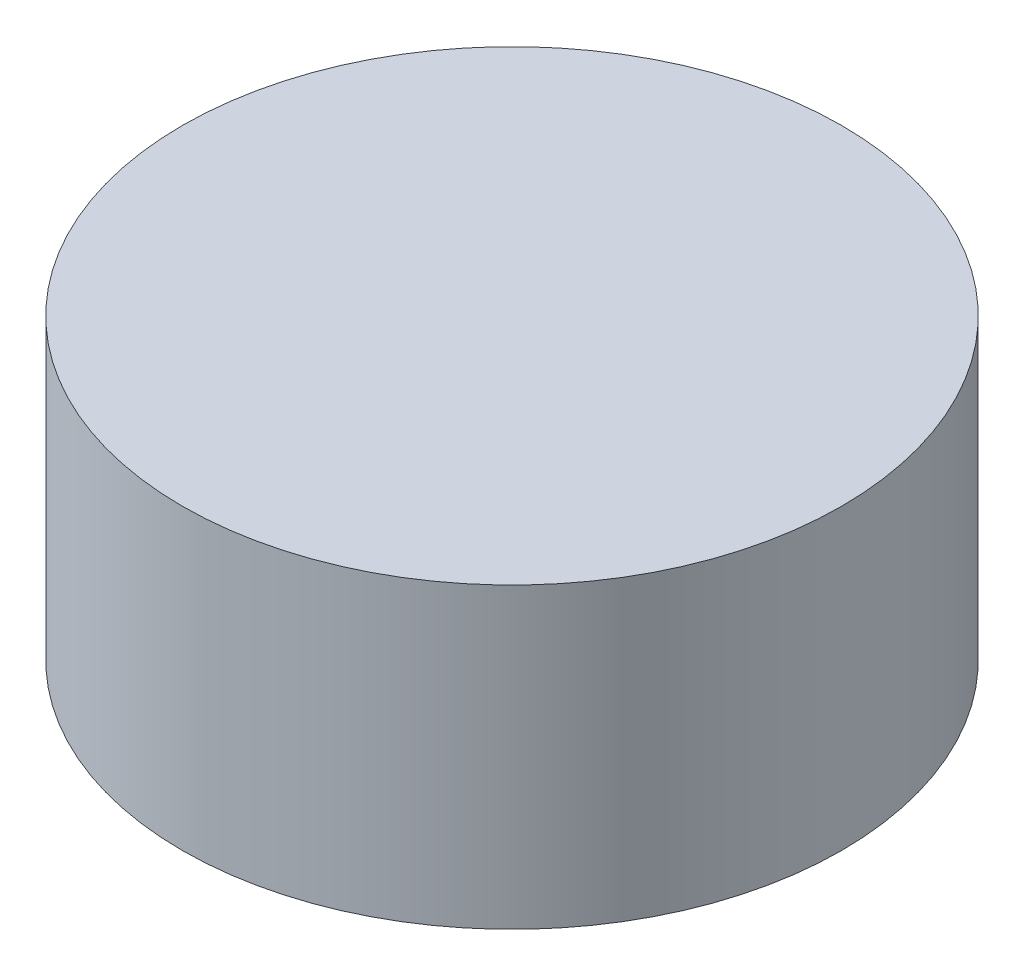
ISO-10303-21;
HEADER;
FILE_DESCRIPTION(('STEP AP214'),'2;1');
FILE_NAME('part.step','',(''),(''),'','','');
FILE_SCHEMA(('AUTOMOTIVE_DESIGN { 1 0 10303 214 1 1 1 1 }'));
ENDSEC;
DATA;
#1=APPLICATION_CONTEXT('core data for automotive mechanical design processes');
#2=APPLICATION_PROTOCOL_DEFINITION('international standard','automotive_design',2000,#1);
#3=PRODUCT_CONTEXT('',#1,'mechanical');
#4=PRODUCT('Part','Part','',(#3));
#5=PRODUCT_RELATED_PRODUCT_CATEGORY('part','',(#4));
#6=PRODUCT_DEFINITION_FORMATION('','',#4);
#7=PRODUCT_DEFINITION_CONTEXT('part definition',#1,'design');
#8=PRODUCT_DEFINITION('design','',#6,#7);
#9=PRODUCT_DEFINITION_SHAPE('','',#8);
#10=(LENGTH_UNIT() NAMED_UNIT(*) SI_UNIT(.MILLI.,.METRE.));
#11=(NAMED_UNIT(*) PLANE_ANGLE_UNIT() SI_UNIT($,.RADIAN.));
#12=(NAMED_UNIT(*) SI_UNIT($,.STERADIAN.) SOLID_ANGLE_UNIT());
#13=UNCERTAINTY_MEASURE_WITH_UNIT(LENGTH_MEASURE(1.E-05),#10,'distance_accuracy_value','');
#14=(GEOMETRIC_REPRESENTATION_CONTEXT(3) GLOBAL_UNCERTAINTY_ASSIGNED_CONTEXT((#13)) GLOBAL_UNIT_ASSIGNED_CONTEXT((#10,
#11,#12)) REPRESENTATION_CONTEXT('',''));
#15=CARTESIAN_POINT('',(0.,0.,0.));
#16=DIRECTION('',(0.,0.,1.));
#17=DIRECTION('',(1.,0.,0.));
#18=AXIS2_PLACEMENT_3D('',#15,#16,#17);
#19=CARTESIAN_POINT('',(-19.8907917391918,15.,-20.6708227877876));
#20=DIRECTION('',(0.,-1.,0.));
#21=DIRECTION('',(0.,0.,-1.));
#22=AXIS2_PLACEMENT_3D('',#19,#20,#21);
#23=CYLINDRICAL_SURFACE('',#22,16.5857257544986);
#24=CARTESIAN_POINT('',(-19.8907917391918,15.,-20.6708227877876));
#25=DIRECTION('',(0.,1.,0.));
#26=DIRECTION('',(0.,0.,1.));
#27=AXIS2_PLACEMENT_3D('',#24,#25,#26);
#28=CIRCLE('',#27,16.5857257544986);
#29=CARTESIAN_POINT('',(-19.8907917391918,15.,-4.08509703328893));
#30=VERTEX_POINT('',#29);
#31=EDGE_CURVE('E10',#30,#30,#28,.T.);
#32=ORIENTED_EDGE('',*,*,#31,.F.);
#33=EDGE_LOOP('',(#32));
#34=FACE_BOUND('',#33,.T.);
#35=CARTESIAN_POINT('',(-19.8907917391918,0.,-20.6708227877876));
#36=DIRECTION('',(0.,1.,0.));
#37=DIRECTION('',(0.,0.,1.));
#38=AXIS2_PLACEMENT_3D('',#35,#36,#37);
#39=CIRCLE('',#38,16.5857257544986);
#40=CARTESIAN_POINT('',(-19.8907917391918,0.,-4.08509703328893));
#41=VERTEX_POINT('',#40);
#42=EDGE_CURVE('E40',#41,#41,#39,.T.);
#43=ORIENTED_EDGE('',*,*,#42,.T.);
#44=EDGE_LOOP('',(#43));
#45=FACE_BOUND('',#44,.T.);
#46=ADVANCED_FACE('F37',(#34,#45),#23,.T.);
#47=CARTESIAN_POINT('',(-19.8907917391918,15.,-20.6708227877876));
#48=DIRECTION('',(0.,1.,0.));
#49=DIRECTION('',(0.,0.,1.));
#50=AXIS2_PLACEMENT_3D('',#47,#48,#49);
#51=PLANE('',#50);
#52=ORIENTED_EDGE('',*,*,#31,.T.);
#53=EDGE_LOOP('',(#52));
#54=FACE_BOUND('',#53,.T.);
#55=ADVANCED_FACE('F54',(#54),#51,.T.);
#56=CARTESIAN_POINT('',(-19.8907917391918,0.,-20.6708227877876));
#57=DIRECTION('',(0.,1.,0.));
#58=DIRECTION('',(0.,0.,1.));
#59=AXIS2_PLACEMENT_3D('',#56,#57,#58);
#60=PLANE('',#59);
#61=ORIENTED_EDGE('',*,*,#42,.F.);
#62=EDGE_LOOP('',(#61));
#63=FACE_BOUND('',#62,.T.);
#64=ADVANCED_FACE('F52',(#63),#60,.F.);
#65=CLOSED_SHELL('',(#46,#55,#64));
#66=MANIFOLD_SOLID_BREP('B2',#65);
#67=ADVANCED_BREP_SHAPE_REPRESENTATION('',(#18,#66),#14);
#68=SHAPE_DEFINITION_REPRESENTATION(#9,#67);
ENDSEC;
END-ISO-10303-21;
